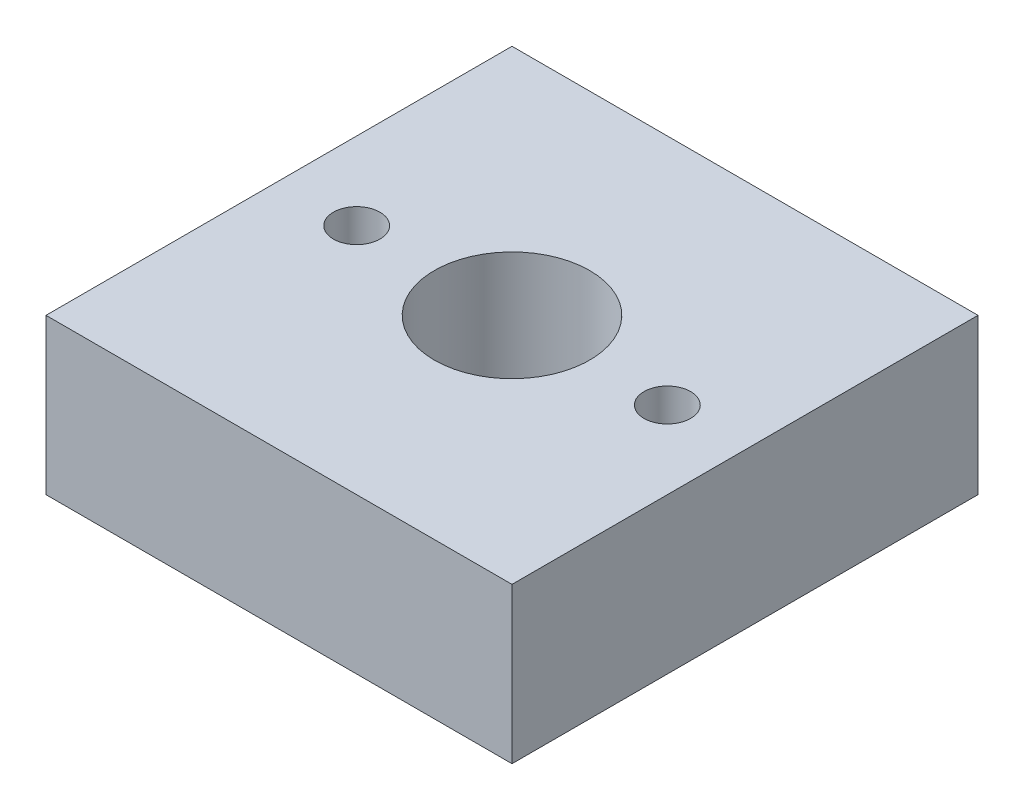
ISO-10303-21;
HEADER;
FILE_DESCRIPTION(('STEP AP214'),'2;1');
FILE_NAME('part.step','',(''),(''),'','','');
FILE_SCHEMA(('AUTOMOTIVE_DESIGN { 1 0 10303 214 1 1 1 1 }'));
ENDSEC;
DATA;
#1=APPLICATION_CONTEXT('core data for automotive mechanical design processes');
#2=APPLICATION_PROTOCOL_DEFINITION('international standard','automotive_design',2000,#1);
#3=PRODUCT_CONTEXT('',#1,'mechanical');
#4=PRODUCT('Part','Part','',(#3));
#5=PRODUCT_RELATED_PRODUCT_CATEGORY('part','',(#4));
#6=PRODUCT_DEFINITION_FORMATION('','',#4);
#7=PRODUCT_DEFINITION_CONTEXT('part definition',#1,'design');
#8=PRODUCT_DEFINITION('design','',#6,#7);
#9=PRODUCT_DEFINITION_SHAPE('','',#8);
#10=(LENGTH_UNIT() NAMED_UNIT(*) SI_UNIT(.MILLI.,.METRE.));
#11=(NAMED_UNIT(*) PLANE_ANGLE_UNIT() SI_UNIT($,.RADIAN.));
#12=(NAMED_UNIT(*) SI_UNIT($,.STERADIAN.) SOLID_ANGLE_UNIT());
#13=UNCERTAINTY_MEASURE_WITH_UNIT(LENGTH_MEASURE(1.E-05),#10,'distance_accuracy_value','');
#14=(GEOMETRIC_REPRESENTATION_CONTEXT(3) GLOBAL_UNCERTAINTY_ASSIGNED_CONTEXT((#13)) GLOBAL_UNIT_ASSIGNED_CONTEXT((#10,
#11,#12)) REPRESENTATION_CONTEXT('',''));
#15=CARTESIAN_POINT('',(0.,0.,0.));
#16=DIRECTION('',(0.,0.,1.));
#17=DIRECTION('',(1.,0.,0.));
#18=AXIS2_PLACEMENT_3D('',#15,#16,#17);
#19=CARTESIAN_POINT('',(0.,10.,0.));
#20=DIRECTION('',(1.,0.,0.));
#21=DIRECTION('',(0.,0.,-1.));
#22=AXIS2_PLACEMENT_3D('',#19,#20,#21);
#23=PLANE('',#22);
#24=DIRECTION('',(0.,0.,1.));
#25=VECTOR('',#24,1.);
#26=CARTESIAN_POINT('',(0.,0.,0.));
#27=LINE('',#26,#25);
#28=CARTESIAN_POINT('',(0.,0.,-30.));
#29=VERTEX_POINT('',#28);
#30=CARTESIAN_POINT('',(0.,0.,0.));
#31=VERTEX_POINT('',#30);
#32=EDGE_CURVE('E96',#29,#31,#27,.T.);
#33=ORIENTED_EDGE('',*,*,#32,.T.);
#34=DIRECTION('',(0.,-1.,0.));
#35=VECTOR('',#34,1.);
#36=CARTESIAN_POINT('',(0.,10.,0.));
#37=LINE('',#36,#35);
#38=CARTESIAN_POINT('',(0.,10.,0.));
#39=VERTEX_POINT('',#38);
#40=EDGE_CURVE('E11',#39,#31,#37,.T.);
#41=ORIENTED_EDGE('',*,*,#40,.F.);
#42=DIRECTION('',(0.,0.,1.));
#43=VECTOR('',#42,1.);
#44=CARTESIAN_POINT('',(0.,10.,0.));
#45=LINE('',#44,#43);
#46=CARTESIAN_POINT('',(0.,10.,-30.));
#47=VERTEX_POINT('',#46);
#48=EDGE_CURVE('E84',#47,#39,#45,.T.);
#49=ORIENTED_EDGE('',*,*,#48,.F.);
#50=DIRECTION('',(0.,-1.,0.));
#51=VECTOR('',#50,1.);
#52=CARTESIAN_POINT('',(0.,10.,-30.));
#53=LINE('',#52,#51);
#54=EDGE_CURVE('E92',#47,#29,#53,.T.);
#55=ORIENTED_EDGE('',*,*,#54,.T.);
#56=EDGE_LOOP('',(#33,#41,#49,#55));
#57=FACE_BOUND('',#56,.T.);
#58=ADVANCED_FACE('F33',(#57),#23,.F.);
#59=CARTESIAN_POINT('',(0.,10.,0.));
#60=DIRECTION('',(0.,0.,-1.));
#61=DIRECTION('',(-1.,0.,0.));
#62=AXIS2_PLACEMENT_3D('',#59,#60,#61);
#63=PLANE('',#62);
#64=DIRECTION('',(1.,0.,0.));
#65=VECTOR('',#64,1.);
#66=CARTESIAN_POINT('',(0.,0.,0.));
#67=LINE('',#66,#65);
#68=CARTESIAN_POINT('',(30.,0.,0.));
#69=VERTEX_POINT('',#68);
#70=EDGE_CURVE('E88',#31,#69,#67,.T.);
#71=ORIENTED_EDGE('',*,*,#70,.T.);
#72=DIRECTION('',(0.,-1.,0.));
#73=VECTOR('',#72,1.);
#74=CARTESIAN_POINT('',(30.,10.,0.));
#75=LINE('',#74,#73);
#76=CARTESIAN_POINT('',(30.,10.,0.));
#77=VERTEX_POINT('',#76);
#78=EDGE_CURVE('E41',#77,#69,#75,.T.);
#79=ORIENTED_EDGE('',*,*,#78,.F.);
#80=DIRECTION('',(1.,0.,0.));
#81=VECTOR('',#80,1.);
#82=CARTESIAN_POINT('',(0.,10.,0.));
#83=LINE('',#82,#81);
#84=EDGE_CURVE('E79',#39,#77,#83,.T.);
#85=ORIENTED_EDGE('',*,*,#84,.F.);
#86=ORIENTED_EDGE('',*,*,#40,.T.);
#87=EDGE_LOOP('',(#71,#79,#85,#86));
#88=FACE_BOUND('',#87,.T.);
#89=ADVANCED_FACE('F87',(#88),#63,.F.);
#90=CARTESIAN_POINT('',(30.,10.,0.));
#91=DIRECTION('',(-1.,0.,0.));
#92=DIRECTION('',(0.,0.,1.));
#93=AXIS2_PLACEMENT_3D('',#90,#91,#92);
#94=PLANE('',#93);
#95=DIRECTION('',(0.,0.,-1.));
#96=VECTOR('',#95,1.);
#97=CARTESIAN_POINT('',(30.,0.,0.));
#98=LINE('',#97,#96);
#99=CARTESIAN_POINT('',(30.,0.,-30.));
#100=VERTEX_POINT('',#99);
#101=EDGE_CURVE('E66',#69,#100,#98,.T.);
#102=ORIENTED_EDGE('',*,*,#101,.T.);
#103=DIRECTION('',(0.,-1.,0.));
#104=VECTOR('',#103,1.);
#105=CARTESIAN_POINT('',(30.,10.,-30.));
#106=LINE('',#105,#104);
#107=CARTESIAN_POINT('',(30.,10.,-30.));
#108=VERTEX_POINT('',#107);
#109=EDGE_CURVE('E89',#108,#100,#106,.T.);
#110=ORIENTED_EDGE('',*,*,#109,.F.);
#111=DIRECTION('',(0.,0.,-1.));
#112=VECTOR('',#111,1.);
#113=CARTESIAN_POINT('',(30.,10.,0.));
#114=LINE('',#113,#112);
#115=EDGE_CURVE('E82',#77,#108,#114,.T.);
#116=ORIENTED_EDGE('',*,*,#115,.F.);
#117=ORIENTED_EDGE('',*,*,#78,.T.);
#118=EDGE_LOOP('',(#102,#110,#116,#117));
#119=FACE_BOUND('',#118,.T.);
#120=ADVANCED_FACE('F90',(#119),#94,.F.);
#121=CARTESIAN_POINT('',(0.,10.,-30.));
#122=DIRECTION('',(0.,0.,1.));
#123=DIRECTION('',(1.,0.,0.));
#124=AXIS2_PLACEMENT_3D('',#121,#122,#123);
#125=PLANE('',#124);
#126=DIRECTION('',(-1.,0.,0.));
#127=VECTOR('',#126,1.);
#128=CARTESIAN_POINT('',(0.,0.,-30.));
#129=LINE('',#128,#127);
#130=EDGE_CURVE('E72',#100,#29,#129,.T.);
#131=ORIENTED_EDGE('',*,*,#130,.T.);
#132=ORIENTED_EDGE('',*,*,#54,.F.);
#133=DIRECTION('',(-1.,0.,0.));
#134=VECTOR('',#133,1.);
#135=CARTESIAN_POINT('',(0.,10.,-30.));
#136=LINE('',#135,#134);
#137=EDGE_CURVE('E49',#108,#47,#136,.T.);
#138=ORIENTED_EDGE('',*,*,#137,.F.);
#139=ORIENTED_EDGE('',*,*,#109,.T.);
#140=EDGE_LOOP('',(#131,#132,#138,#139));
#141=FACE_BOUND('',#140,.T.);
#142=ADVANCED_FACE('F104',(#141),#125,.F.);
#143=CARTESIAN_POINT('',(0.,10.,0.));
#144=DIRECTION('',(0.,-1.,0.));
#145=DIRECTION('',(0.,0.,-1.));
#146=AXIS2_PLACEMENT_3D('',#143,#144,#145);
#147=PLANE('',#146);
#148=CARTESIAN_POINT('',(5.,10.,-15.));
#149=DIRECTION('',(0.,1.,0.));
#150=DIRECTION('',(0.,0.,1.));
#151=AXIS2_PLACEMENT_3D('',#148,#149,#150);
#152=CIRCLE('',#151,1.49999999999999);
#153=CARTESIAN_POINT('',(5.,10.,-13.5));
#154=VERTEX_POINT('',#153);
#155=EDGE_CURVE('E124',#154,#154,#152,.T.);
#156=ORIENTED_EDGE('',*,*,#155,.F.);
#157=EDGE_LOOP('',(#156));
#158=FACE_BOUND('',#157,.T.);
#159=CARTESIAN_POINT('',(25.,10.,-15.));
#160=DIRECTION('',(0.,1.,0.));
#161=DIRECTION('',(0.,0.,1.));
#162=AXIS2_PLACEMENT_3D('',#159,#160,#161);
#163=CIRCLE('',#162,1.49999999999999);
#164=CARTESIAN_POINT('',(25.,10.,-13.5));
#165=VERTEX_POINT('',#164);
#166=EDGE_CURVE('E118',#165,#165,#163,.T.);
#167=ORIENTED_EDGE('',*,*,#166,.F.);
#168=EDGE_LOOP('',(#167));
#169=FACE_BOUND('',#168,.T.);
#170=CARTESIAN_POINT('',(15.,10.,-15.));
#171=DIRECTION('',(0.,1.,0.));
#172=DIRECTION('',(0.,0.,1.));
#173=AXIS2_PLACEMENT_3D('',#170,#171,#172);
#174=CIRCLE('',#173,5.);
#175=CARTESIAN_POINT('',(15.,10.,-10.));
#176=VERTEX_POINT('',#175);
#177=EDGE_CURVE('E110',#176,#176,#174,.T.);
#178=ORIENTED_EDGE('',*,*,#177,.F.);
#179=EDGE_LOOP('',(#178));
#180=FACE_BOUND('',#179,.T.);
#181=ORIENTED_EDGE('',*,*,#48,.T.);
#182=ORIENTED_EDGE('',*,*,#84,.T.);
#183=ORIENTED_EDGE('',*,*,#115,.T.);
#184=ORIENTED_EDGE('',*,*,#137,.T.);
#185=EDGE_LOOP('',(#181,#182,#183,#184));
#186=FACE_BOUND('',#185,.T.);
#187=ADVANCED_FACE('F80',(#158,#169,#180,#186),#147,.F.);
#188=CARTESIAN_POINT('',(0.,0.,0.));
#189=DIRECTION('',(0.,-1.,0.));
#190=DIRECTION('',(0.,0.,-1.));
#191=AXIS2_PLACEMENT_3D('',#188,#189,#190);
#192=PLANE('',#191);
#193=CARTESIAN_POINT('',(5.,0.,-15.));
#194=DIRECTION('',(0.,1.,0.));
#195=DIRECTION('',(0.,0.,1.));
#196=AXIS2_PLACEMENT_3D('',#193,#194,#195);
#197=CIRCLE('',#196,1.5);
#198=CARTESIAN_POINT('',(5.,0.,-13.5));
#199=VERTEX_POINT('',#198);
#200=EDGE_CURVE('E121',#199,#199,#197,.T.);
#201=ORIENTED_EDGE('',*,*,#200,.T.);
#202=EDGE_LOOP('',(#201));
#203=FACE_BOUND('',#202,.T.);
#204=CARTESIAN_POINT('',(25.,0.,-15.));
#205=DIRECTION('',(0.,1.,0.));
#206=DIRECTION('',(0.,0.,1.));
#207=AXIS2_PLACEMENT_3D('',#204,#205,#206);
#208=CIRCLE('',#207,1.5);
#209=CARTESIAN_POINT('',(25.,0.,-13.5));
#210=VERTEX_POINT('',#209);
#211=EDGE_CURVE('E113',#210,#210,#208,.T.);
#212=ORIENTED_EDGE('',*,*,#211,.T.);
#213=EDGE_LOOP('',(#212));
#214=FACE_BOUND('',#213,.T.);
#215=CARTESIAN_POINT('',(15.,0.,-15.));
#216=DIRECTION('',(0.,1.,0.));
#217=DIRECTION('',(0.,0.,1.));
#218=AXIS2_PLACEMENT_3D('',#215,#216,#217);
#219=CIRCLE('',#218,5.);
#220=CARTESIAN_POINT('',(15.,0.,-10.));
#221=VERTEX_POINT('',#220);
#222=EDGE_CURVE('E99',#221,#221,#219,.T.);
#223=ORIENTED_EDGE('',*,*,#222,.T.);
#224=EDGE_LOOP('',(#223));
#225=FACE_BOUND('',#224,.T.);
#226=ORIENTED_EDGE('',*,*,#32,.F.);
#227=ORIENTED_EDGE('',*,*,#130,.F.);
#228=ORIENTED_EDGE('',*,*,#101,.F.);
#229=ORIENTED_EDGE('',*,*,#70,.F.);
#230=EDGE_LOOP('',(#226,#227,#228,#229));
#231=FACE_BOUND('',#230,.T.);
#232=ADVANCED_FACE('F107',(#203,#214,#225,#231),#192,.T.);
#233=CARTESIAN_POINT('',(15.,0.,-15.));
#234=DIRECTION('',(0.,1.,0.));
#235=DIRECTION('',(0.,0.,1.));
#236=AXIS2_PLACEMENT_3D('',#233,#234,#235);
#237=CYLINDRICAL_SURFACE('',#236,5.);
#238=ORIENTED_EDGE('',*,*,#222,.F.);
#239=EDGE_LOOP('',(#238));
#240=FACE_BOUND('',#239,.T.);
#241=ORIENTED_EDGE('',*,*,#177,.T.);
#242=EDGE_LOOP('',(#241));
#243=FACE_BOUND('',#242,.T.);
#244=ADVANCED_FACE('F137',(#240,#243),#237,.F.);
#245=CARTESIAN_POINT('',(25.,10.,-15.));
#246=DIRECTION('',(0.,1.,0.));
#247=DIRECTION('',(0.,0.,1.));
#248=AXIS2_PLACEMENT_3D('',#245,#246,#247);
#249=CYLINDRICAL_SURFACE('',#248,1.49999999999999);
#250=ORIENTED_EDGE('',*,*,#211,.F.);
#251=EDGE_LOOP('',(#250));
#252=FACE_BOUND('',#251,.T.);
#253=ORIENTED_EDGE('',*,*,#166,.T.);
#254=EDGE_LOOP('',(#253));
#255=FACE_BOUND('',#254,.T.);
#256=ADVANCED_FACE('F139',(#252,#255),#249,.F.);
#257=CARTESIAN_POINT('',(5.,10.,-15.));
#258=DIRECTION('',(0.,1.,0.));
#259=DIRECTION('',(0.,0.,1.));
#260=AXIS2_PLACEMENT_3D('',#257,#258,#259);
#261=CYLINDRICAL_SURFACE('',#260,1.49999999999999);
#262=ORIENTED_EDGE('',*,*,#200,.F.);
#263=EDGE_LOOP('',(#262));
#264=FACE_BOUND('',#263,.T.);
#265=ORIENTED_EDGE('',*,*,#155,.T.);
#266=EDGE_LOOP('',(#265));
#267=FACE_BOUND('',#266,.T.);
#268=ADVANCED_FACE('F128',(#264,#267),#261,.F.);
#269=CLOSED_SHELL('',(#58,#89,#120,#142,#187,#232,#244,#256,#268));
#270=MANIFOLD_SOLID_BREP('B2',#269);
#271=ADVANCED_BREP_SHAPE_REPRESENTATION('',(#18,#270),#14);
#272=SHAPE_DEFINITION_REPRESENTATION(#9,#271);
ENDSEC;
END-ISO-10303-21;
